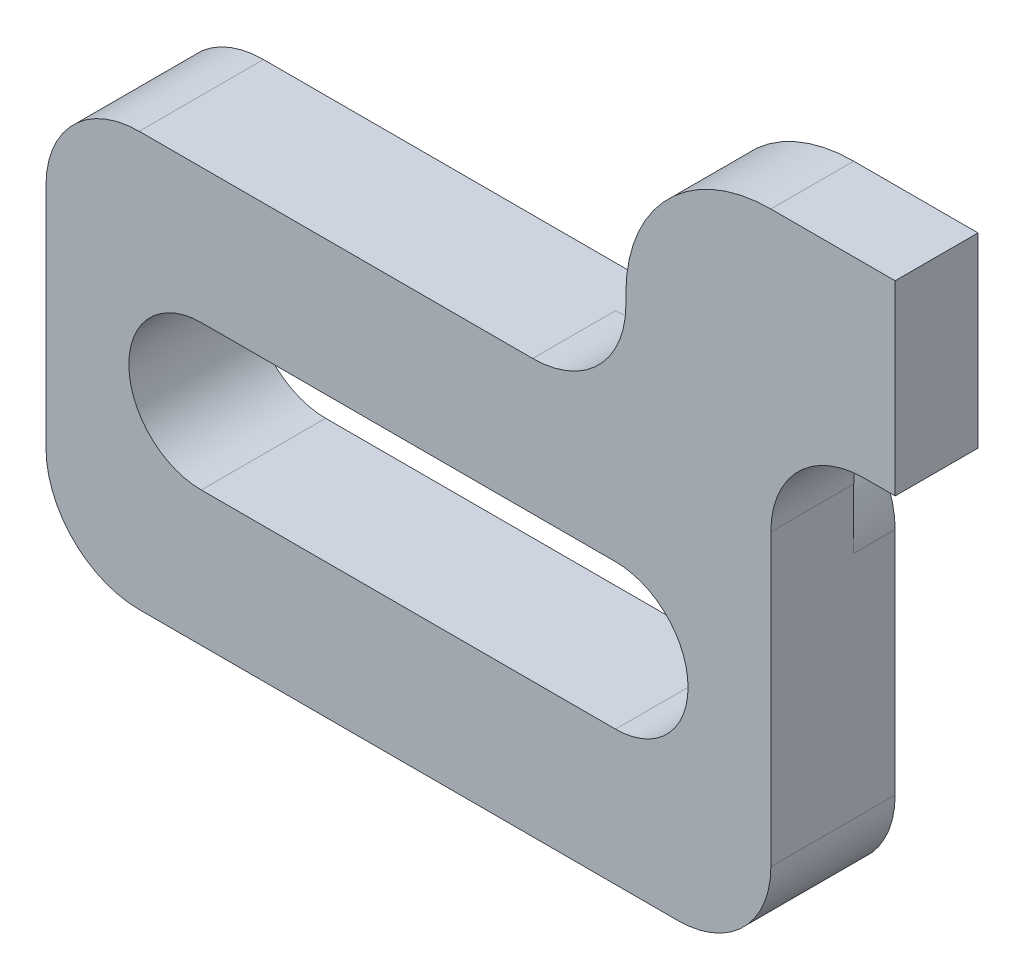
ISO-10303-21;
HEADER;
FILE_DESCRIPTION(('STEP AP214'),'2;1');
FILE_NAME('part.step','',(''),(''),'','','');
FILE_SCHEMA(('AUTOMOTIVE_DESIGN { 1 0 10303 214 1 1 1 1 }'));
ENDSEC;
DATA;
#1=APPLICATION_CONTEXT('core data for automotive mechanical design processes');
#2=APPLICATION_PROTOCOL_DEFINITION('international standard','automotive_design',2000,#1);
#3=PRODUCT_CONTEXT('',#1,'mechanical');
#4=PRODUCT('Part','Part','',(#3));
#5=PRODUCT_RELATED_PRODUCT_CATEGORY('part','',(#4));
#6=PRODUCT_DEFINITION_FORMATION('','',#4);
#7=PRODUCT_DEFINITION_CONTEXT('part definition',#1,'design');
#8=PRODUCT_DEFINITION('design','',#6,#7);
#9=PRODUCT_DEFINITION_SHAPE('','',#8);
#10=(LENGTH_UNIT() NAMED_UNIT(*) SI_UNIT(.MILLI.,.METRE.));
#11=(NAMED_UNIT(*) PLANE_ANGLE_UNIT() SI_UNIT($,.RADIAN.));
#12=(NAMED_UNIT(*) SI_UNIT($,.STERADIAN.) SOLID_ANGLE_UNIT());
#13=UNCERTAINTY_MEASURE_WITH_UNIT(LENGTH_MEASURE(1.E-05),#10,'distance_accuracy_value','');
#14=(GEOMETRIC_REPRESENTATION_CONTEXT(3) GLOBAL_UNCERTAINTY_ASSIGNED_CONTEXT((#13)) GLOBAL_UNIT_ASSIGNED_CONTEXT((#10,
#11,#12)) REPRESENTATION_CONTEXT('',''));
#15=CARTESIAN_POINT('',(0.,0.,0.));
#16=DIRECTION('',(0.,0.,1.));
#17=DIRECTION('',(1.,0.,0.));
#18=AXIS2_PLACEMENT_3D('',#15,#16,#17);
#19=CARTESIAN_POINT('',(19.75,9.25,3.));
#20=DIRECTION('',(0.,0.,-1.));
#21=DIRECTION('',(-1.,0.,0.));
#22=AXIS2_PLACEMENT_3D('',#19,#20,#21);
#23=CYLINDRICAL_SURFACE('',#22,2.25);
#24=DIRECTION('',(0.,0.,-1.));
#25=VECTOR('',#24,1.);
#26=CARTESIAN_POINT('',(17.5,9.25,3.));
#27=LINE('',#26,#25);
#28=CARTESIAN_POINT('',(17.5,9.25,3.));
#29=VERTEX_POINT('',#28);
#30=CARTESIAN_POINT('',(17.5,9.25,1.));
#31=VERTEX_POINT('',#30);
#32=EDGE_CURVE('E290',#29,#31,#27,.T.);
#33=ORIENTED_EDGE('',*,*,#32,.T.);
#34=CARTESIAN_POINT('',(19.75,9.25,1.));
#35=DIRECTION('',(0.,0.,1.));
#36=DIRECTION('',(1.,0.,0.));
#37=AXIS2_PLACEMENT_3D('',#34,#35,#36);
#38=CIRCLE('',#37,2.25);
#39=CARTESIAN_POINT('',(19.75,11.5,1.));
#40=VERTEX_POINT('',#39);
#41=EDGE_CURVE('E194',#31,#40,#38,.F.);
#42=ORIENTED_EDGE('',*,*,#41,.T.);
#43=DIRECTION('',(0.,0.,-1.));
#44=VECTOR('',#43,1.);
#45=CARTESIAN_POINT('',(19.75,11.5,3.));
#46=LINE('',#45,#44);
#47=CARTESIAN_POINT('',(19.75,11.5,3.));
#48=VERTEX_POINT('',#47);
#49=EDGE_CURVE('E287',#48,#40,#46,.T.);
#50=ORIENTED_EDGE('',*,*,#49,.F.);
#51=CARTESIAN_POINT('',(19.75,9.25,3.));
#52=DIRECTION('',(0.,0.,-1.));
#53=DIRECTION('',(1.,0.,0.));
#54=AXIS2_PLACEMENT_3D('',#51,#52,#53);
#55=CIRCLE('',#54,2.25);
#56=EDGE_CURVE('E267',#29,#48,#55,.T.);
#57=ORIENTED_EDGE('',*,*,#56,.F.);
#58=EDGE_LOOP('',(#33,#42,#50,#57));
#59=FACE_BOUND('',#58,.T.);
#60=ADVANCED_FACE('F34',(#59),#23,.F.);
#61=CARTESIAN_POINT('',(17.5,12.5,3.));
#62=DIRECTION('',(0.,0.,-1.));
#63=DIRECTION('',(-1.,0.,0.));
#64=AXIS2_PLACEMENT_3D('',#61,#62,#63);
#65=PLANE('',#64);
#66=DIRECTION('',(0.,1.,0.));
#67=VECTOR('',#66,1.);
#68=CARTESIAN_POINT('',(20.5,11.5,3.));
#69=LINE('',#68,#67);
#70=CARTESIAN_POINT('',(20.5,11.5,3.));
#71=VERTEX_POINT('',#70);
#72=CARTESIAN_POINT('',(20.5,16.,3.));
#73=VERTEX_POINT('',#72);
#74=EDGE_CURVE('E241',#71,#73,#69,.T.);
#75=ORIENTED_EDGE('',*,*,#74,.T.);
#76=DIRECTION('',(-1.,0.,0.));
#77=VECTOR('',#76,1.);
#78=CARTESIAN_POINT('',(17.5,16.,3.));
#79=LINE('',#78,#77);
#80=CARTESIAN_POINT('',(17.5,16.,3.));
#81=VERTEX_POINT('',#80);
#82=EDGE_CURVE('E244',#73,#81,#79,.T.);
#83=ORIENTED_EDGE('',*,*,#82,.T.);
#84=CARTESIAN_POINT('',(17.5,12.5,3.));
#85=DIRECTION('',(0.,0.,1.));
#86=DIRECTION('',(-1.,0.,0.));
#87=AXIS2_PLACEMENT_3D('',#84,#85,#86);
#88=CIRCLE('',#87,3.5);
#89=CARTESIAN_POINT('',(14.,12.5,3.));
#90=VERTEX_POINT('',#89);
#91=EDGE_CURVE('E247',#81,#90,#88,.T.);
#92=ORIENTED_EDGE('',*,*,#91,.T.);
#93=DIRECTION('',(0.,-1.,0.));
#94=VECTOR('',#93,1.);
#95=CARTESIAN_POINT('',(14.,12.25,3.));
#96=LINE('',#95,#94);
#97=CARTESIAN_POINT('',(14.,12.25,3.));
#98=VERTEX_POINT('',#97);
#99=EDGE_CURVE('E249',#90,#98,#96,.T.);
#100=ORIENTED_EDGE('',*,*,#99,.T.);
#101=CARTESIAN_POINT('',(11.75,12.25,3.));
#102=DIRECTION('',(0.,0.,-1.));
#103=DIRECTION('',(1.,0.,0.));
#104=AXIS2_PLACEMENT_3D('',#101,#102,#103);
#105=CIRCLE('',#104,2.25);
#106=CARTESIAN_POINT('',(11.75,10.,3.));
#107=VERTEX_POINT('',#106);
#108=EDGE_CURVE('E251',#98,#107,#105,.T.);
#109=ORIENTED_EDGE('',*,*,#108,.T.);
#110=DIRECTION('',(-1.,0.,0.));
#111=VECTOR('',#110,1.);
#112=CARTESIAN_POINT('',(2.25,10.,3.));
#113=LINE('',#112,#111);
#114=CARTESIAN_POINT('',(2.25,10.,3.));
#115=VERTEX_POINT('',#114);
#116=EDGE_CURVE('E253',#107,#115,#113,.T.);
#117=ORIENTED_EDGE('',*,*,#116,.T.);
#118=CARTESIAN_POINT('',(2.25,7.75,3.));
#119=DIRECTION('',(0.,0.,1.));
#120=DIRECTION('',(-1.,0.,0.));
#121=AXIS2_PLACEMENT_3D('',#118,#119,#120);
#122=CIRCLE('',#121,2.25);
#123=CARTESIAN_POINT('',(0.,7.75,3.));
#124=VERTEX_POINT('',#123);
#125=EDGE_CURVE('E255',#115,#124,#122,.T.);
#126=ORIENTED_EDGE('',*,*,#125,.T.);
#127=DIRECTION('',(0.,-1.,0.));
#128=VECTOR('',#127,1.);
#129=CARTESIAN_POINT('',(0.,2.25,3.));
#130=LINE('',#129,#128);
#131=CARTESIAN_POINT('',(0.,2.25,3.));
#132=VERTEX_POINT('',#131);
#133=EDGE_CURVE('E257',#124,#132,#130,.T.);
#134=ORIENTED_EDGE('',*,*,#133,.T.);
#135=CARTESIAN_POINT('',(2.25,2.25,3.));
#136=DIRECTION('',(0.,0.,1.));
#137=DIRECTION('',(-1.,0.,0.));
#138=AXIS2_PLACEMENT_3D('',#135,#136,#137);
#139=CIRCLE('',#138,2.25);
#140=CARTESIAN_POINT('',(2.25,0.,3.));
#141=VERTEX_POINT('',#140);
#142=EDGE_CURVE('E259',#132,#141,#139,.T.);
#143=ORIENTED_EDGE('',*,*,#142,.T.);
#144=DIRECTION('',(1.,0.,0.));
#145=VECTOR('',#144,1.);
#146=CARTESIAN_POINT('',(2.25,0.,3.));
#147=LINE('',#146,#145);
#148=CARTESIAN_POINT('',(15.25,0.,3.));
#149=VERTEX_POINT('',#148);
#150=EDGE_CURVE('E261',#141,#149,#147,.T.);
#151=ORIENTED_EDGE('',*,*,#150,.T.);
#152=CARTESIAN_POINT('',(15.25,2.25,3.));
#153=DIRECTION('',(0.,0.,1.));
#154=DIRECTION('',(1.,0.,0.));
#155=AXIS2_PLACEMENT_3D('',#152,#153,#154);
#156=CIRCLE('',#155,2.25);
#157=CARTESIAN_POINT('',(17.5,2.25,3.));
#158=VERTEX_POINT('',#157);
#159=EDGE_CURVE('E263',#149,#158,#156,.T.);
#160=ORIENTED_EDGE('',*,*,#159,.T.);
#161=DIRECTION('',(0.,1.,0.));
#162=VECTOR('',#161,1.);
#163=CARTESIAN_POINT('',(17.5,2.25,3.));
#164=LINE('',#163,#162);
#165=EDGE_CURVE('E265',#158,#29,#164,.T.);
#166=ORIENTED_EDGE('',*,*,#165,.T.);
#167=ORIENTED_EDGE('',*,*,#56,.T.);
#168=DIRECTION('',(1.,0.,0.));
#169=VECTOR('',#168,1.);
#170=CARTESIAN_POINT('',(19.75,11.5,3.));
#171=LINE('',#170,#169);
#172=EDGE_CURVE('E269',#48,#71,#171,.T.);
#173=ORIENTED_EDGE('',*,*,#172,.T.);
#174=EDGE_LOOP('',(#75,#83,#92,#100,#109,#117,#126,#134,#143,#151,#160,#166,#167,#173));
#175=FACE_BOUND('',#174,.T.);
#176=CARTESIAN_POINT('',(3.75,5.,3.));
#177=DIRECTION('',(0.,0.,1.));
#178=DIRECTION('',(1.,0.,0.));
#179=AXIS2_PLACEMENT_3D('',#176,#177,#178);
#180=CIRCLE('',#179,1.75);
#181=CARTESIAN_POINT('',(3.75,6.75,3.));
#182=VERTEX_POINT('',#181);
#183=CARTESIAN_POINT('',(3.75,3.25,3.));
#184=VERTEX_POINT('',#183);
#185=EDGE_CURVE('E212',#182,#184,#180,.T.);
#186=ORIENTED_EDGE('',*,*,#185,.F.);
#187=DIRECTION('',(-1.,0.,0.));
#188=VECTOR('',#187,1.);
#189=CARTESIAN_POINT('',(3.75,6.75,3.));
#190=LINE('',#189,#188);
#191=CARTESIAN_POINT('',(13.75,6.75,3.));
#192=VERTEX_POINT('',#191);
#193=EDGE_CURVE('E219',#192,#182,#190,.T.);
#194=ORIENTED_EDGE('',*,*,#193,.F.);
#195=CARTESIAN_POINT('',(13.75,5.,3.));
#196=DIRECTION('',(0.,0.,1.));
#197=DIRECTION('',(1.,0.,0.));
#198=AXIS2_PLACEMENT_3D('',#195,#196,#197);
#199=CIRCLE('',#198,1.75);
#200=CARTESIAN_POINT('',(13.75,3.25,3.));
#201=VERTEX_POINT('',#200);
#202=EDGE_CURVE('E217',#201,#192,#199,.T.);
#203=ORIENTED_EDGE('',*,*,#202,.F.);
#204=DIRECTION('',(1.,0.,0.));
#205=VECTOR('',#204,1.);
#206=CARTESIAN_POINT('',(3.75,3.25,3.));
#207=LINE('',#206,#205);
#208=EDGE_CURVE('E214',#184,#201,#207,.T.);
#209=ORIENTED_EDGE('',*,*,#208,.F.);
#210=EDGE_LOOP('',(#186,#194,#203,#209));
#211=FACE_BOUND('',#210,.T.);
#212=ADVANCED_FACE('F339',(#175,#211),#65,.F.);
#213=CARTESIAN_POINT('',(17.5,12.5,0.));
#214=DIRECTION('',(0.,0.,-1.));
#215=DIRECTION('',(-1.,0.,0.));
#216=AXIS2_PLACEMENT_3D('',#213,#214,#215);
#217=PLANE('',#216);
#218=CARTESIAN_POINT('',(15.3,7.8,0.));
#219=DIRECTION('',(0.,0.,1.));
#220=DIRECTION('',(-1.,0.,0.));
#221=AXIS2_PLACEMENT_3D('',#218,#219,#220);
#222=CIRCLE('',#221,2.2);
#223=CARTESIAN_POINT('',(17.5,7.8,0.));
#224=VERTEX_POINT('',#223);
#225=CARTESIAN_POINT('',(15.3,10.,0.));
#226=VERTEX_POINT('',#225);
#227=EDGE_CURVE('E177',#224,#226,#222,.T.);
#228=ORIENTED_EDGE('',*,*,#227,.F.);
#229=DIRECTION('',(0.,1.,0.));
#230=VECTOR('',#229,1.);
#231=CARTESIAN_POINT('',(17.5,2.25,0.));
#232=LINE('',#231,#230);
#233=CARTESIAN_POINT('',(17.5,2.25,0.));
#234=VERTEX_POINT('',#233);
#235=EDGE_CURVE('E245',#234,#224,#232,.T.);
#236=ORIENTED_EDGE('',*,*,#235,.F.);
#237=CARTESIAN_POINT('',(15.25,2.25,0.));
#238=DIRECTION('',(0.,0.,1.));
#239=DIRECTION('',(1.,0.,0.));
#240=AXIS2_PLACEMENT_3D('',#237,#238,#239);
#241=CIRCLE('',#240,2.25);
#242=CARTESIAN_POINT('',(15.25,0.,0.));
#243=VERTEX_POINT('',#242);
#244=EDGE_CURVE('E281',#243,#234,#241,.T.);
#245=ORIENTED_EDGE('',*,*,#244,.F.);
#246=DIRECTION('',(1.,0.,0.));
#247=VECTOR('',#246,1.);
#248=CARTESIAN_POINT('',(2.25,0.,0.));
#249=LINE('',#248,#247);
#250=CARTESIAN_POINT('',(2.25,0.,0.));
#251=VERTEX_POINT('',#250);
#252=EDGE_CURVE('E279',#251,#243,#249,.T.);
#253=ORIENTED_EDGE('',*,*,#252,.F.);
#254=CARTESIAN_POINT('',(2.25,2.25,0.));
#255=DIRECTION('',(0.,0.,1.));
#256=DIRECTION('',(-1.,0.,0.));
#257=AXIS2_PLACEMENT_3D('',#254,#255,#256);
#258=CIRCLE('',#257,2.25);
#259=CARTESIAN_POINT('',(0.,2.25,0.));
#260=VERTEX_POINT('',#259);
#261=EDGE_CURVE('E277',#260,#251,#258,.T.);
#262=ORIENTED_EDGE('',*,*,#261,.F.);
#263=DIRECTION('',(0.,-1.,0.));
#264=VECTOR('',#263,1.);
#265=CARTESIAN_POINT('',(0.,2.25,0.));
#266=LINE('',#265,#264);
#267=CARTESIAN_POINT('',(0.,7.75,0.));
#268=VERTEX_POINT('',#267);
#269=EDGE_CURVE('E275',#268,#260,#266,.T.);
#270=ORIENTED_EDGE('',*,*,#269,.F.);
#271=CARTESIAN_POINT('',(2.25,7.75,0.));
#272=DIRECTION('',(0.,0.,1.));
#273=DIRECTION('',(-1.,0.,0.));
#274=AXIS2_PLACEMENT_3D('',#271,#272,#273);
#275=CIRCLE('',#274,2.25);
#276=CARTESIAN_POINT('',(2.25,10.,0.));
#277=VERTEX_POINT('',#276);
#278=EDGE_CURVE('E273',#277,#268,#275,.T.);
#279=ORIENTED_EDGE('',*,*,#278,.F.);
#280=DIRECTION('',(-1.,0.,0.));
#281=VECTOR('',#280,1.);
#282=CARTESIAN_POINT('',(2.25,10.,0.));
#283=LINE('',#282,#281);
#284=EDGE_CURVE('E240',#226,#277,#283,.T.);
#285=ORIENTED_EDGE('',*,*,#284,.F.);
#286=EDGE_LOOP('',(#228,#236,#245,#253,#262,#270,#279,#285));
#287=FACE_BOUND('',#286,.T.);
#288=DIRECTION('',(-1.,0.,0.));
#289=VECTOR('',#288,1.);
#290=CARTESIAN_POINT('',(3.75,6.75,0.));
#291=LINE('',#290,#289);
#292=CARTESIAN_POINT('',(13.75,6.75,0.));
#293=VERTEX_POINT('',#292);
#294=CARTESIAN_POINT('',(3.75,6.75,0.));
#295=VERTEX_POINT('',#294);
#296=EDGE_CURVE('E215',#293,#295,#291,.T.);
#297=ORIENTED_EDGE('',*,*,#296,.T.);
#298=CARTESIAN_POINT('',(3.75,5.,0.));
#299=DIRECTION('',(0.,0.,1.));
#300=DIRECTION('',(1.,0.,0.));
#301=AXIS2_PLACEMENT_3D('',#298,#299,#300);
#302=CIRCLE('',#301,1.75);
#303=CARTESIAN_POINT('',(3.75,3.25,0.));
#304=VERTEX_POINT('',#303);
#305=EDGE_CURVE('E211',#295,#304,#302,.T.);
#306=ORIENTED_EDGE('',*,*,#305,.T.);
#307=DIRECTION('',(1.,0.,0.));
#308=VECTOR('',#307,1.);
#309=CARTESIAN_POINT('',(3.75,3.25,0.));
#310=LINE('',#309,#308);
#311=CARTESIAN_POINT('',(13.75,3.25,0.));
#312=VERTEX_POINT('',#311);
#313=EDGE_CURVE('E224',#304,#312,#310,.T.);
#314=ORIENTED_EDGE('',*,*,#313,.T.);
#315=CARTESIAN_POINT('',(13.75,5.,0.));
#316=DIRECTION('',(0.,0.,1.));
#317=DIRECTION('',(1.,0.,0.));
#318=AXIS2_PLACEMENT_3D('',#315,#316,#317);
#319=CIRCLE('',#318,1.75);
#320=EDGE_CURVE('E227',#312,#293,#319,.T.);
#321=ORIENTED_EDGE('',*,*,#320,.T.);
#322=EDGE_LOOP('',(#297,#306,#314,#321));
#323=FACE_BOUND('',#322,.T.);
#324=ADVANCED_FACE('F347',(#287,#323),#217,.T.);
#325=CARTESIAN_POINT('',(20.5,11.5,3.));
#326=DIRECTION('',(-1.,0.,0.));
#327=DIRECTION('',(0.,0.,1.));
#328=AXIS2_PLACEMENT_3D('',#325,#326,#327);
#329=PLANE('',#328);
#330=DIRECTION('',(0.,0.,-1.));
#331=VECTOR('',#330,1.);
#332=CARTESIAN_POINT('',(20.5,11.5,3.));
#333=LINE('',#332,#331);
#334=CARTESIAN_POINT('',(20.5,11.5,1.));
#335=VERTEX_POINT('',#334);
#336=EDGE_CURVE('E271',#71,#335,#333,.T.);
#337=ORIENTED_EDGE('',*,*,#336,.T.);
#338=DIRECTION('',(0.,-1.,0.));
#339=VECTOR('',#338,1.);
#340=CARTESIAN_POINT('',(20.5,11.5,1.));
#341=LINE('',#340,#339);
#342=CARTESIAN_POINT('',(20.5,16.,1.));
#343=VERTEX_POINT('',#342);
#344=EDGE_CURVE('E49',#343,#335,#341,.T.);
#345=ORIENTED_EDGE('',*,*,#344,.F.);
#346=DIRECTION('',(0.,0.,-1.));
#347=VECTOR('',#346,1.);
#348=CARTESIAN_POINT('',(20.5,16.,3.));
#349=LINE('',#348,#347);
#350=EDGE_CURVE('E42',#73,#343,#349,.T.);
#351=ORIENTED_EDGE('',*,*,#350,.F.);
#352=ORIENTED_EDGE('',*,*,#74,.F.);
#353=EDGE_LOOP('',(#337,#345,#351,#352));
#354=FACE_BOUND('',#353,.T.);
#355=ADVANCED_FACE('F36',(#354),#329,.F.);
#356=CARTESIAN_POINT('',(17.5,16.,3.));
#357=DIRECTION('',(0.,-1.,0.));
#358=DIRECTION('',(0.,0.,-1.));
#359=AXIS2_PLACEMENT_3D('',#356,#357,#358);
#360=PLANE('',#359);
#361=ORIENTED_EDGE('',*,*,#350,.T.);
#362=DIRECTION('',(-1.,0.,0.));
#363=VECTOR('',#362,1.);
#364=CARTESIAN_POINT('',(17.5,16.,1.));
#365=LINE('',#364,#363);
#366=CARTESIAN_POINT('',(17.5,16.,1.));
#367=VERTEX_POINT('',#366);
#368=EDGE_CURVE('E208',#343,#367,#365,.T.);
#369=ORIENTED_EDGE('',*,*,#368,.T.);
#370=DIRECTION('',(0.,0.,-1.));
#371=VECTOR('',#370,1.);
#372=CARTESIAN_POINT('',(17.5,16.,3.));
#373=LINE('',#372,#371);
#374=EDGE_CURVE('E318',#81,#367,#373,.T.);
#375=ORIENTED_EDGE('',*,*,#374,.F.);
#376=ORIENTED_EDGE('',*,*,#82,.F.);
#377=EDGE_LOOP('',(#361,#369,#375,#376));
#378=FACE_BOUND('',#377,.T.);
#379=ADVANCED_FACE('F323',(#378),#360,.F.);
#380=CARTESIAN_POINT('',(17.5,12.5,3.));
#381=DIRECTION('',(0.,0.,-1.));
#382=DIRECTION('',(-1.,0.,0.));
#383=AXIS2_PLACEMENT_3D('',#380,#381,#382);
#384=CYLINDRICAL_SURFACE('',#383,3.5);
#385=ORIENTED_EDGE('',*,*,#374,.T.);
#386=CARTESIAN_POINT('',(17.5,12.5,1.));
#387=DIRECTION('',(0.,0.,1.));
#388=DIRECTION('',(1.,0.,0.));
#389=AXIS2_PLACEMENT_3D('',#386,#387,#388);
#390=CIRCLE('',#389,3.5);
#391=CARTESIAN_POINT('',(14.,12.5,1.));
#392=VERTEX_POINT('',#391);
#393=EDGE_CURVE('E205',#367,#392,#390,.T.);
#394=ORIENTED_EDGE('',*,*,#393,.T.);
#395=DIRECTION('',(0.,0.,-1.));
#396=VECTOR('',#395,1.);
#397=CARTESIAN_POINT('',(14.,12.5,3.));
#398=LINE('',#397,#396);
#399=EDGE_CURVE('E315',#90,#392,#398,.T.);
#400=ORIENTED_EDGE('',*,*,#399,.F.);
#401=ORIENTED_EDGE('',*,*,#91,.F.);
#402=EDGE_LOOP('',(#385,#394,#400,#401));
#403=FACE_BOUND('',#402,.T.);
#404=ADVANCED_FACE('F371',(#403),#384,.T.);
#405=CARTESIAN_POINT('',(14.,12.25,3.));
#406=DIRECTION('',(1.,0.,0.));
#407=DIRECTION('',(0.,0.,-1.));
#408=AXIS2_PLACEMENT_3D('',#405,#406,#407);
#409=PLANE('',#408);
#410=ORIENTED_EDGE('',*,*,#399,.T.);
#411=DIRECTION('',(0.,-1.,0.));
#412=VECTOR('',#411,1.);
#413=CARTESIAN_POINT('',(14.,12.25,1.));
#414=LINE('',#413,#412);
#415=CARTESIAN_POINT('',(14.,12.25,1.));
#416=VERTEX_POINT('',#415);
#417=EDGE_CURVE('E202',#392,#416,#414,.T.);
#418=ORIENTED_EDGE('',*,*,#417,.T.);
#419=DIRECTION('',(0.,0.,-1.));
#420=VECTOR('',#419,1.);
#421=CARTESIAN_POINT('',(14.,12.25,3.));
#422=LINE('',#421,#420);
#423=EDGE_CURVE('E312',#98,#416,#422,.T.);
#424=ORIENTED_EDGE('',*,*,#423,.F.);
#425=ORIENTED_EDGE('',*,*,#99,.F.);
#426=EDGE_LOOP('',(#410,#418,#424,#425));
#427=FACE_BOUND('',#426,.T.);
#428=ADVANCED_FACE('F367',(#427),#409,.F.);
#429=CARTESIAN_POINT('',(11.75,12.25,3.));
#430=DIRECTION('',(0.,0.,-1.));
#431=DIRECTION('',(-1.,0.,0.));
#432=AXIS2_PLACEMENT_3D('',#429,#430,#431);
#433=CYLINDRICAL_SURFACE('',#432,2.25);
#434=ORIENTED_EDGE('',*,*,#423,.T.);
#435=CARTESIAN_POINT('',(11.75,12.25,1.));
#436=DIRECTION('',(0.,0.,1.));
#437=DIRECTION('',(1.,0.,0.));
#438=AXIS2_PLACEMENT_3D('',#435,#436,#437);
#439=CIRCLE('',#438,2.25);
#440=CARTESIAN_POINT('',(11.75,10.,1.));
#441=VERTEX_POINT('',#440);
#442=EDGE_CURVE('E196',#416,#441,#439,.F.);
#443=ORIENTED_EDGE('',*,*,#442,.T.);
#444=DIRECTION('',(0.,0.,-1.));
#445=VECTOR('',#444,1.);
#446=CARTESIAN_POINT('',(11.75,10.,3.));
#447=LINE('',#446,#445);
#448=EDGE_CURVE('E193',#107,#441,#447,.T.);
#449=ORIENTED_EDGE('',*,*,#448,.F.);
#450=ORIENTED_EDGE('',*,*,#108,.F.);
#451=EDGE_LOOP('',(#434,#443,#449,#450));
#452=FACE_BOUND('',#451,.T.);
#453=ADVANCED_FACE('F365',(#452),#433,.F.);
#454=CARTESIAN_POINT('',(2.25,10.,3.));
#455=DIRECTION('',(0.,-1.,0.));
#456=DIRECTION('',(1.,0.,0.));
#457=AXIS2_PLACEMENT_3D('',#454,#455,#456);
#458=PLANE('',#457);
#459=DIRECTION('',(-1.,0.,0.));
#460=VECTOR('',#459,1.);
#461=CARTESIAN_POINT('',(-0.473585846016533,10.,1.));
#462=LINE('',#461,#460);
#463=CARTESIAN_POINT('',(15.3,10.,1.));
#464=VERTEX_POINT('',#463);
#465=EDGE_CURVE('E184',#464,#441,#462,.T.);
#466=ORIENTED_EDGE('',*,*,#465,.F.);
#467=DIRECTION('',(0.,0.,-1.));
#468=VECTOR('',#467,1.);
#469=CARTESIAN_POINT('',(15.3,10.,1.));
#470=LINE('',#469,#468);
#471=EDGE_CURVE('E171',#464,#226,#470,.T.);
#472=ORIENTED_EDGE('',*,*,#471,.T.);
#473=ORIENTED_EDGE('',*,*,#284,.T.);
#474=DIRECTION('',(0.,0.,-1.));
#475=VECTOR('',#474,1.);
#476=CARTESIAN_POINT('',(2.25,10.,3.));
#477=LINE('',#476,#475);
#478=EDGE_CURVE('E308',#115,#277,#477,.T.);
#479=ORIENTED_EDGE('',*,*,#478,.F.);
#480=ORIENTED_EDGE('',*,*,#116,.F.);
#481=ORIENTED_EDGE('',*,*,#448,.T.);
#482=EDGE_LOOP('',(#466,#472,#473,#479,#480,#481));
#483=FACE_BOUND('',#482,.T.);
#484=ADVANCED_FACE('F190',(#483),#458,.F.);
#485=CARTESIAN_POINT('',(2.25,7.75,3.));
#486=DIRECTION('',(0.,0.,-1.));
#487=DIRECTION('',(-1.,0.,0.));
#488=AXIS2_PLACEMENT_3D('',#485,#486,#487);
#489=CYLINDRICAL_SURFACE('',#488,2.25);
#490=ORIENTED_EDGE('',*,*,#278,.T.);
#491=DIRECTION('',(0.,0.,-1.));
#492=VECTOR('',#491,1.);
#493=CARTESIAN_POINT('',(0.,7.75,3.));
#494=LINE('',#493,#492);
#495=EDGE_CURVE('E305',#124,#268,#494,.T.);
#496=ORIENTED_EDGE('',*,*,#495,.F.);
#497=ORIENTED_EDGE('',*,*,#125,.F.);
#498=ORIENTED_EDGE('',*,*,#478,.T.);
#499=EDGE_LOOP('',(#490,#496,#497,#498));
#500=FACE_BOUND('',#499,.T.);
#501=ADVANCED_FACE('F357',(#500),#489,.T.);
#502=CARTESIAN_POINT('',(0.,2.25,3.));
#503=DIRECTION('',(1.,0.,0.));
#504=DIRECTION('',(0.,0.,-1.));
#505=AXIS2_PLACEMENT_3D('',#502,#503,#504);
#506=PLANE('',#505);
#507=ORIENTED_EDGE('',*,*,#269,.T.);
#508=DIRECTION('',(0.,0.,-1.));
#509=VECTOR('',#508,1.);
#510=CARTESIAN_POINT('',(0.,2.25,3.));
#511=LINE('',#510,#509);
#512=EDGE_CURVE('E302',#132,#260,#511,.T.);
#513=ORIENTED_EDGE('',*,*,#512,.F.);
#514=ORIENTED_EDGE('',*,*,#133,.F.);
#515=ORIENTED_EDGE('',*,*,#495,.T.);
#516=EDGE_LOOP('',(#507,#513,#514,#515));
#517=FACE_BOUND('',#516,.T.);
#518=ADVANCED_FACE('F400',(#517),#506,.F.);
#519=CARTESIAN_POINT('',(2.25,2.25,3.));
#520=DIRECTION('',(0.,0.,-1.));
#521=DIRECTION('',(-1.,0.,0.));
#522=AXIS2_PLACEMENT_3D('',#519,#520,#521);
#523=CYLINDRICAL_SURFACE('',#522,2.25);
#524=ORIENTED_EDGE('',*,*,#261,.T.);
#525=DIRECTION('',(0.,0.,-1.));
#526=VECTOR('',#525,1.);
#527=CARTESIAN_POINT('',(2.25,0.,3.));
#528=LINE('',#527,#526);
#529=EDGE_CURVE('E299',#141,#251,#528,.T.);
#530=ORIENTED_EDGE('',*,*,#529,.F.);
#531=ORIENTED_EDGE('',*,*,#142,.F.);
#532=ORIENTED_EDGE('',*,*,#512,.T.);
#533=EDGE_LOOP('',(#524,#530,#531,#532));
#534=FACE_BOUND('',#533,.T.);
#535=ADVANCED_FACE('F396',(#534),#523,.T.);
#536=CARTESIAN_POINT('',(2.25,0.,3.));
#537=DIRECTION('',(0.,1.,0.));
#538=DIRECTION('',(0.,0.,1.));
#539=AXIS2_PLACEMENT_3D('',#536,#537,#538);
#540=PLANE('',#539);
#541=ORIENTED_EDGE('',*,*,#252,.T.);
#542=DIRECTION('',(0.,0.,-1.));
#543=VECTOR('',#542,1.);
#544=CARTESIAN_POINT('',(15.25,0.,3.));
#545=LINE('',#544,#543);
#546=EDGE_CURVE('E296',#149,#243,#545,.T.);
#547=ORIENTED_EDGE('',*,*,#546,.F.);
#548=ORIENTED_EDGE('',*,*,#150,.F.);
#549=ORIENTED_EDGE('',*,*,#529,.T.);
#550=EDGE_LOOP('',(#541,#547,#548,#549));
#551=FACE_BOUND('',#550,.T.);
#552=ADVANCED_FACE('F393',(#551),#540,.F.);
#553=CARTESIAN_POINT('',(15.25,2.25,3.));
#554=DIRECTION('',(0.,0.,-1.));
#555=DIRECTION('',(-1.,0.,0.));
#556=AXIS2_PLACEMENT_3D('',#553,#554,#555);
#557=CYLINDRICAL_SURFACE('',#556,2.25);
#558=ORIENTED_EDGE('',*,*,#244,.T.);
#559=DIRECTION('',(0.,0.,-1.));
#560=VECTOR('',#559,1.);
#561=CARTESIAN_POINT('',(17.5,2.25,3.));
#562=LINE('',#561,#560);
#563=EDGE_CURVE('E293',#158,#234,#562,.T.);
#564=ORIENTED_EDGE('',*,*,#563,.F.);
#565=ORIENTED_EDGE('',*,*,#159,.F.);
#566=ORIENTED_EDGE('',*,*,#546,.T.);
#567=EDGE_LOOP('',(#558,#564,#565,#566));
#568=FACE_BOUND('',#567,.T.);
#569=ADVANCED_FACE('F390',(#568),#557,.T.);
#570=CARTESIAN_POINT('',(17.5,2.25,3.));
#571=DIRECTION('',(-1.,0.,0.));
#572=DIRECTION('',(0.,-1.,0.));
#573=AXIS2_PLACEMENT_3D('',#570,#571,#572);
#574=PLANE('',#573);
#575=ORIENTED_EDGE('',*,*,#235,.T.);
#576=DIRECTION('',(0.,0.,-1.));
#577=VECTOR('',#576,1.);
#578=CARTESIAN_POINT('',(17.5,7.8,1.));
#579=LINE('',#578,#577);
#580=CARTESIAN_POINT('',(17.5,7.8,1.));
#581=VERTEX_POINT('',#580);
#582=EDGE_CURVE('E181',#581,#224,#579,.T.);
#583=ORIENTED_EDGE('',*,*,#582,.F.);
#584=DIRECTION('',(0.,-1.,0.));
#585=VECTOR('',#584,1.);
#586=CARTESIAN_POINT('',(17.5,2.25,1.));
#587=LINE('',#586,#585);
#588=EDGE_CURVE('E187',#31,#581,#587,.T.);
#589=ORIENTED_EDGE('',*,*,#588,.F.);
#590=ORIENTED_EDGE('',*,*,#32,.F.);
#591=ORIENTED_EDGE('',*,*,#165,.F.);
#592=ORIENTED_EDGE('',*,*,#563,.T.);
#593=EDGE_LOOP('',(#575,#583,#589,#590,#591,#592));
#594=FACE_BOUND('',#593,.T.);
#595=ADVANCED_FACE('F335',(#594),#574,.F.);
#596=CARTESIAN_POINT('',(19.75,11.5,3.));
#597=DIRECTION('',(0.,1.,0.));
#598=DIRECTION('',(0.,0.,1.));
#599=AXIS2_PLACEMENT_3D('',#596,#597,#598);
#600=PLANE('',#599);
#601=ORIENTED_EDGE('',*,*,#49,.T.);
#602=DIRECTION('',(1.,0.,0.));
#603=VECTOR('',#602,1.);
#604=CARTESIAN_POINT('',(19.75,11.5,1.));
#605=LINE('',#604,#603);
#606=EDGE_CURVE('E11',#40,#335,#605,.T.);
#607=ORIENTED_EDGE('',*,*,#606,.T.);
#608=ORIENTED_EDGE('',*,*,#336,.F.);
#609=ORIENTED_EDGE('',*,*,#172,.F.);
#610=EDGE_LOOP('',(#601,#607,#608,#609));
#611=FACE_BOUND('',#610,.T.);
#612=ADVANCED_FACE('F330',(#611),#600,.F.);
#613=CARTESIAN_POINT('',(3.75,5.,3.));
#614=DIRECTION('',(0.,0.,-1.));
#615=DIRECTION('',(-1.,0.,0.));
#616=AXIS2_PLACEMENT_3D('',#613,#614,#615);
#617=CYLINDRICAL_SURFACE('',#616,1.75);
#618=ORIENTED_EDGE('',*,*,#305,.F.);
#619=DIRECTION('',(0.,0.,-1.));
#620=VECTOR('',#619,1.);
#621=CARTESIAN_POINT('',(3.75,6.75,3.));
#622=LINE('',#621,#620);
#623=EDGE_CURVE('E221',#182,#295,#622,.T.);
#624=ORIENTED_EDGE('',*,*,#623,.F.);
#625=ORIENTED_EDGE('',*,*,#185,.T.);
#626=DIRECTION('',(0.,0.,-1.));
#627=VECTOR('',#626,1.);
#628=CARTESIAN_POINT('',(3.75,3.25,3.));
#629=LINE('',#628,#627);
#630=EDGE_CURVE('E237',#184,#304,#629,.T.);
#631=ORIENTED_EDGE('',*,*,#630,.T.);
#632=EDGE_LOOP('',(#618,#624,#625,#631));
#633=FACE_BOUND('',#632,.T.);
#634=ADVANCED_FACE('F452',(#633),#617,.F.);
#635=CARTESIAN_POINT('',(3.75,3.25,3.));
#636=DIRECTION('',(0.,1.,0.));
#637=DIRECTION('',(-1.,0.,0.));
#638=AXIS2_PLACEMENT_3D('',#635,#636,#637);
#639=PLANE('',#638);
#640=ORIENTED_EDGE('',*,*,#313,.F.);
#641=ORIENTED_EDGE('',*,*,#630,.F.);
#642=ORIENTED_EDGE('',*,*,#208,.T.);
#643=DIRECTION('',(0.,0.,-1.));
#644=VECTOR('',#643,1.);
#645=CARTESIAN_POINT('',(13.75,3.25,3.));
#646=LINE('',#645,#644);
#647=EDGE_CURVE('E235',#201,#312,#646,.T.);
#648=ORIENTED_EDGE('',*,*,#647,.T.);
#649=EDGE_LOOP('',(#640,#641,#642,#648));
#650=FACE_BOUND('',#649,.T.);
#651=ADVANCED_FACE('F457',(#650),#639,.T.);
#652=CARTESIAN_POINT('',(13.75,5.,3.));
#653=DIRECTION('',(0.,0.,-1.));
#654=DIRECTION('',(-1.,0.,0.));
#655=AXIS2_PLACEMENT_3D('',#652,#653,#654);
#656=CYLINDRICAL_SURFACE('',#655,1.75);
#657=ORIENTED_EDGE('',*,*,#320,.F.);
#658=ORIENTED_EDGE('',*,*,#647,.F.);
#659=ORIENTED_EDGE('',*,*,#202,.T.);
#660=DIRECTION('',(0.,0.,-1.));
#661=VECTOR('',#660,1.);
#662=CARTESIAN_POINT('',(13.75,6.75,3.));
#663=LINE('',#662,#661);
#664=EDGE_CURVE('E56',#192,#293,#663,.T.);
#665=ORIENTED_EDGE('',*,*,#664,.T.);
#666=EDGE_LOOP('',(#657,#658,#659,#665));
#667=FACE_BOUND('',#666,.T.);
#668=ADVANCED_FACE('F465',(#667),#656,.F.);
#669=CARTESIAN_POINT('',(3.75,6.75,3.));
#670=DIRECTION('',(0.,-1.,0.));
#671=DIRECTION('',(1.,0.,0.));
#672=AXIS2_PLACEMENT_3D('',#669,#670,#671);
#673=PLANE('',#672);
#674=ORIENTED_EDGE('',*,*,#296,.F.);
#675=ORIENTED_EDGE('',*,*,#664,.F.);
#676=ORIENTED_EDGE('',*,*,#193,.T.);
#677=ORIENTED_EDGE('',*,*,#623,.T.);
#678=EDGE_LOOP('',(#674,#675,#676,#677));
#679=FACE_BOUND('',#678,.T.);
#680=ADVANCED_FACE('F473',(#679),#673,.T.);
#681=CARTESIAN_POINT('',(0.,0.,1.));
#682=DIRECTION('',(0.,0.,1.));
#683=DIRECTION('',(1.,0.,0.));
#684=AXIS2_PLACEMENT_3D('',#681,#682,#683);
#685=PLANE('',#684);
#686=ORIENTED_EDGE('',*,*,#606,.F.);
#687=ORIENTED_EDGE('',*,*,#41,.F.);
#688=ORIENTED_EDGE('',*,*,#588,.T.);
#689=CARTESIAN_POINT('',(15.3,7.8,1.));
#690=DIRECTION('',(0.,0.,1.));
#691=DIRECTION('',(-1.,0.,0.));
#692=AXIS2_PLACEMENT_3D('',#689,#690,#691);
#693=CIRCLE('',#692,2.2);
#694=EDGE_CURVE('E174',#581,#464,#693,.T.);
#695=ORIENTED_EDGE('',*,*,#694,.T.);
#696=ORIENTED_EDGE('',*,*,#465,.T.);
#697=ORIENTED_EDGE('',*,*,#442,.F.);
#698=ORIENTED_EDGE('',*,*,#417,.F.);
#699=ORIENTED_EDGE('',*,*,#393,.F.);
#700=ORIENTED_EDGE('',*,*,#368,.F.);
#701=ORIENTED_EDGE('',*,*,#344,.T.);
#702=EDGE_LOOP('',(#686,#687,#688,#695,#696,#697,#698,#699,#700,#701));
#703=FACE_BOUND('',#702,.T.);
#704=ADVANCED_FACE('F183',(#703),#685,.F.);
#705=CARTESIAN_POINT('',(15.3,7.8,1.));
#706=DIRECTION('',(0.,0.,-1.));
#707=DIRECTION('',(-1.,0.,0.));
#708=AXIS2_PLACEMENT_3D('',#705,#706,#707);
#709=CYLINDRICAL_SURFACE('',#708,2.2);
#710=ORIENTED_EDGE('',*,*,#227,.T.);
#711=ORIENTED_EDGE('',*,*,#471,.F.);
#712=ORIENTED_EDGE('',*,*,#694,.F.);
#713=ORIENTED_EDGE('',*,*,#582,.T.);
#714=EDGE_LOOP('',(#710,#711,#712,#713));
#715=FACE_BOUND('',#714,.T.);
#716=ADVANCED_FACE('F173',(#715),#709,.T.);
#717=CLOSED_SHELL('',(#60,#212,#324,#355,#379,#404,#428,#453,#484,#501,#518,#535,#552,#569,#595,
#612,#634,#651,#668,#680,#704,#716));
#718=MANIFOLD_SOLID_BREP('B2',#717);
#719=ADVANCED_BREP_SHAPE_REPRESENTATION('',(#18,#718),#14);
#720=SHAPE_DEFINITION_REPRESENTATION(#9,#719);
ENDSEC;
END-ISO-10303-21;
